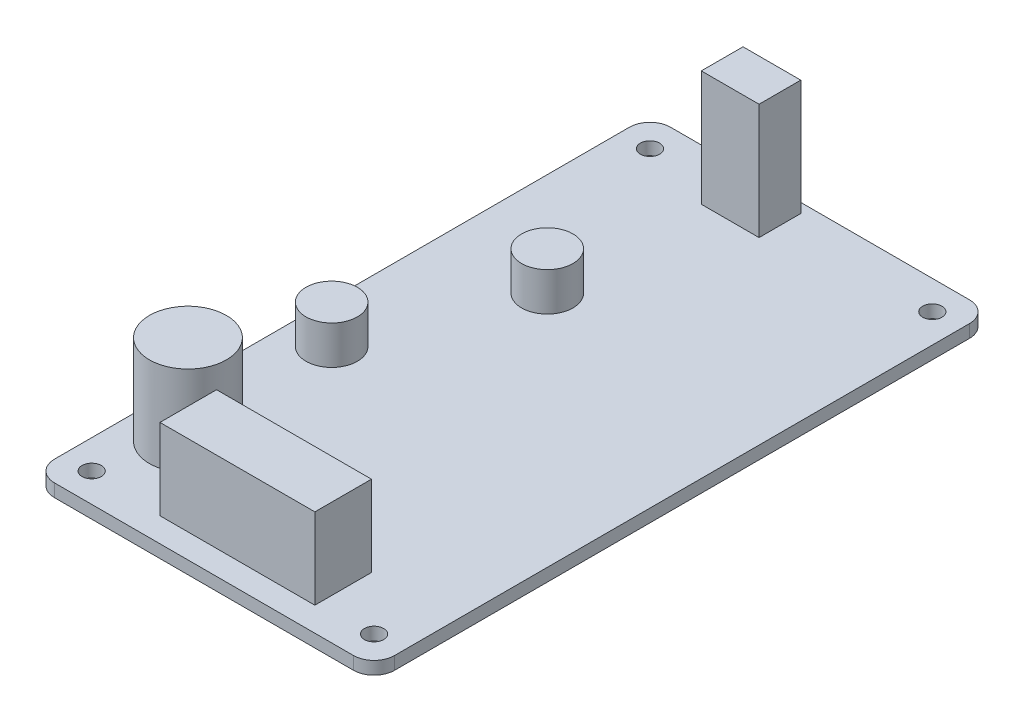
ISO-10303-21;
HEADER;
FILE_DESCRIPTION(('STEP AP214'),'2;1');
FILE_NAME('part.step','',(''),(''),'','','');
FILE_SCHEMA(('AUTOMOTIVE_DESIGN { 1 0 10303 214 1 1 1 1 }'));
ENDSEC;
DATA;
#1=APPLICATION_CONTEXT('core data for automotive mechanical design processes');
#2=APPLICATION_PROTOCOL_DEFINITION('international standard','automotive_design',2000,#1);
#3=PRODUCT_CONTEXT('',#1,'mechanical');
#4=PRODUCT('Part','Part','',(#3));
#5=PRODUCT_RELATED_PRODUCT_CATEGORY('part','',(#4));
#6=PRODUCT_DEFINITION_FORMATION('','',#4);
#7=PRODUCT_DEFINITION_CONTEXT('part definition',#1,'design');
#8=PRODUCT_DEFINITION('design','',#6,#7);
#9=PRODUCT_DEFINITION_SHAPE('','',#8);
#10=(LENGTH_UNIT() NAMED_UNIT(*) SI_UNIT(.MILLI.,.METRE.));
#11=(NAMED_UNIT(*) PLANE_ANGLE_UNIT() SI_UNIT($,.RADIAN.));
#12=(NAMED_UNIT(*) SI_UNIT($,.STERADIAN.) SOLID_ANGLE_UNIT());
#13=UNCERTAINTY_MEASURE_WITH_UNIT(LENGTH_MEASURE(1.E-05),#10,'distance_accuracy_value','');
#14=(GEOMETRIC_REPRESENTATION_CONTEXT(3) GLOBAL_UNCERTAINTY_ASSIGNED_CONTEXT((#13)) GLOBAL_UNIT_ASSIGNED_CONTEXT((#10,
#11,#12)) REPRESENTATION_CONTEXT('',''));
#15=CARTESIAN_POINT('',(0.,0.,0.));
#16=DIRECTION('',(0.,0.,1.));
#17=DIRECTION('',(1.,0.,0.));
#18=AXIS2_PLACEMENT_3D('',#15,#16,#17);
#19=CARTESIAN_POINT('',(-18.494375,0.,35.56));
#20=DIRECTION('',(0.,-1.,0.));
#21=DIRECTION('',(0.,0.,-1.));
#22=AXIS2_PLACEMENT_3D('',#19,#20,#21);
#23=PLANE('',#22);
#24=CARTESIAN_POINT('',(-15.954375,0.,6.34999999999999));
#25=DIRECTION('',(0.,-1.,0.));
#26=DIRECTION('',(0.,0.,-1.));
#27=AXIS2_PLACEMENT_3D('',#24,#25,#26);
#28=CIRCLE('',#27,3.175);
#29=CARTESIAN_POINT('',(-15.954375,0.,3.17499999999999));
#30=VERTEX_POINT('',#29);
#31=EDGE_CURVE('E42',#30,#30,#28,.F.);
#32=ORIENTED_EDGE('',*,*,#31,.F.);
#33=EDGE_LOOP('',(#32));
#34=FACE_BOUND('',#33,.T.);
#35=CARTESIAN_POINT('',(17.4625,0.,-34.528125));
#36=DIRECTION('',(0.,-1.,0.));
#37=DIRECTION('',(0.,0.,-1.));
#38=AXIS2_PLACEMENT_3D('',#35,#36,#37);
#39=CIRCLE('',#38,1.190625);
#40=CARTESIAN_POINT('',(17.4625,0.,-35.71875));
#41=VERTEX_POINT('',#40);
#42=EDGE_CURVE('E287',#41,#41,#39,.T.);
#43=ORIENTED_EDGE('',*,*,#42,.T.);
#44=EDGE_LOOP('',(#43));
#45=FACE_BOUND('',#44,.T.);
#46=CARTESIAN_POINT('',(17.4625,0.,34.528125));
#47=DIRECTION('',(0.,1.,0.));
#48=DIRECTION('',(0.,0.,1.));
#49=AXIS2_PLACEMENT_3D('',#46,#47,#48);
#50=CIRCLE('',#49,1.190625);
#51=CARTESIAN_POINT('',(17.4625,0.,35.71875));
#52=VERTEX_POINT('',#51);
#53=EDGE_CURVE('E291',#52,#52,#50,.T.);
#54=ORIENTED_EDGE('',*,*,#53,.F.);
#55=EDGE_LOOP('',(#54));
#56=FACE_BOUND('',#55,.T.);
#57=DIRECTION('',(0.,0.,1.));
#58=VECTOR('',#57,1.);
#59=CARTESIAN_POINT('',(-8.44549999999997,0.,28.1));
#60=LINE('',#59,#58);
#61=CARTESIAN_POINT('',(-8.44549999999997,0.,28.1));
#62=VERTEX_POINT('',#61);
#63=CARTESIAN_POINT('',(-8.44549999999997,0.,35.1));
#64=VERTEX_POINT('',#63);
#65=EDGE_CURVE('E177',#62,#64,#60,.T.);
#66=ORIENTED_EDGE('',*,*,#65,.F.);
#67=DIRECTION('',(1.,0.,0.));
#68=VECTOR('',#67,1.);
#69=CARTESIAN_POINT('',(-8.44549999999997,0.,28.1));
#70=LINE('',#69,#68);
#71=CARTESIAN_POINT('',(10.715625,0.,28.1));
#72=VERTEX_POINT('',#71);
#73=EDGE_CURVE('E173',#62,#72,#70,.T.);
#74=ORIENTED_EDGE('',*,*,#73,.T.);
#75=DIRECTION('',(0.,0.,1.));
#76=VECTOR('',#75,1.);
#77=CARTESIAN_POINT('',(10.715625,0.,28.1));
#78=LINE('',#77,#76);
#79=CARTESIAN_POINT('',(10.715625,0.,35.1));
#80=VERTEX_POINT('',#79);
#81=EDGE_CURVE('E49',#72,#80,#78,.T.);
#82=ORIENTED_EDGE('',*,*,#81,.T.);
#83=DIRECTION('',(1.,0.,0.));
#84=VECTOR('',#83,1.);
#85=CARTESIAN_POINT('',(-8.44549999999997,0.,35.1));
#86=LINE('',#85,#84);
#87=EDGE_CURVE('E643',#64,#80,#86,.T.);
#88=ORIENTED_EDGE('',*,*,#87,.F.);
#89=EDGE_LOOP('',(#66,#74,#82,#88));
#90=FACE_BOUND('',#89,.T.);
#91=DIRECTION('',(1.,0.,0.));
#92=VECTOR('',#91,1.);
#93=CARTESIAN_POINT('',(-8.334375,0.,-36.909375));
#94=LINE('',#93,#92);
#95=CARTESIAN_POINT('',(-8.334375,0.,-36.909375));
#96=VERTEX_POINT('',#95);
#97=CARTESIAN_POINT('',(-1.19062499999998,0.,-36.909375));
#98=VERTEX_POINT('',#97);
#99=EDGE_CURVE('E247',#96,#98,#94,.T.);
#100=ORIENTED_EDGE('',*,*,#99,.T.);
#101=DIRECTION('',(0.,0.,1.));
#102=VECTOR('',#101,1.);
#103=CARTESIAN_POINT('',(-1.19062499999998,0.,-36.909375));
#104=LINE('',#103,#102);
#105=CARTESIAN_POINT('',(-1.19062499999998,0.,-31.75));
#106=VERTEX_POINT('',#105);
#107=EDGE_CURVE('E259',#98,#106,#104,.T.);
#108=ORIENTED_EDGE('',*,*,#107,.T.);
#109=DIRECTION('',(1.,0.,0.));
#110=VECTOR('',#109,1.);
#111=CARTESIAN_POINT('',(-8.334375,0.,-31.75));
#112=LINE('',#111,#110);
#113=CARTESIAN_POINT('',(-8.334375,0.,-31.75));
#114=VERTEX_POINT('',#113);
#115=EDGE_CURVE('E262',#114,#106,#112,.T.);
#116=ORIENTED_EDGE('',*,*,#115,.F.);
#117=DIRECTION('',(0.,0.,1.));
#118=VECTOR('',#117,1.);
#119=CARTESIAN_POINT('',(-8.334375,0.,-36.909375));
#120=LINE('',#119,#118);
#121=EDGE_CURVE('E251',#96,#114,#120,.T.);
#122=ORIENTED_EDGE('',*,*,#121,.F.);
#123=EDGE_LOOP('',(#100,#108,#116,#122));
#124=FACE_BOUND('',#123,.T.);
#125=CARTESIAN_POINT('',(-18.494375,0.,35.56));
#126=DIRECTION('',(0.,-1.,0.));
#127=DIRECTION('',(0.,0.,-1.));
#128=AXIS2_PLACEMENT_3D('',#125,#126,#127);
#129=CIRCLE('',#128,2.54);
#130=CARTESIAN_POINT('',(-18.494375,0.,38.1));
#131=VERTEX_POINT('',#130);
#132=CARTESIAN_POINT('',(-21.034375,0.,35.56));
#133=VERTEX_POINT('',#132);
#134=EDGE_CURVE('E179',#131,#133,#129,.T.);
#135=ORIENTED_EDGE('',*,*,#134,.F.);
#136=DIRECTION('',(-1.,0.,0.));
#137=VECTOR('',#136,1.);
#138=CARTESIAN_POINT('',(18.494375,0.,38.1));
#139=LINE('',#138,#137);
#140=CARTESIAN_POINT('',(18.494375,0.,38.1));
#141=VERTEX_POINT('',#140);
#142=EDGE_CURVE('E192',#141,#131,#139,.T.);
#143=ORIENTED_EDGE('',*,*,#142,.F.);
#144=CARTESIAN_POINT('',(18.494375,0.,35.56));
#145=DIRECTION('',(0.,1.,0.));
#146=DIRECTION('',(0.,0.,1.));
#147=AXIS2_PLACEMENT_3D('',#144,#145,#146);
#148=CIRCLE('',#147,2.54);
#149=CARTESIAN_POINT('',(21.034375,0.,35.56));
#150=VERTEX_POINT('',#149);
#151=EDGE_CURVE('E226',#141,#150,#148,.T.);
#152=ORIENTED_EDGE('',*,*,#151,.T.);
#153=DIRECTION('',(0.,0.,-1.));
#154=VECTOR('',#153,1.);
#155=CARTESIAN_POINT('',(21.034375,0.,35.56));
#156=LINE('',#155,#154);
#157=CARTESIAN_POINT('',(21.034375,0.,-35.56));
#158=VERTEX_POINT('',#157);
#159=EDGE_CURVE('E223',#150,#158,#156,.T.);
#160=ORIENTED_EDGE('',*,*,#159,.T.);
#161=CARTESIAN_POINT('',(18.494375,0.,-35.56));
#162=DIRECTION('',(0.,1.,0.));
#163=DIRECTION('',(0.,0.,1.));
#164=AXIS2_PLACEMENT_3D('',#161,#162,#163);
#165=CIRCLE('',#164,2.54);
#166=CARTESIAN_POINT('',(18.494375,0.,-38.1));
#167=VERTEX_POINT('',#166);
#168=EDGE_CURVE('E220',#158,#167,#165,.T.);
#169=ORIENTED_EDGE('',*,*,#168,.T.);
#170=DIRECTION('',(-1.,0.,0.));
#171=VECTOR('',#170,1.);
#172=CARTESIAN_POINT('',(18.494375,0.,-38.1));
#173=LINE('',#172,#171);
#174=CARTESIAN_POINT('',(-18.494375,0.,-38.1));
#175=VERTEX_POINT('',#174);
#176=EDGE_CURVE('E217',#167,#175,#173,.T.);
#177=ORIENTED_EDGE('',*,*,#176,.T.);
#178=CARTESIAN_POINT('',(-18.494375,0.,-35.56));
#179=DIRECTION('',(0.,1.,0.));
#180=DIRECTION('',(0.,0.,1.));
#181=AXIS2_PLACEMENT_3D('',#178,#179,#180);
#182=CIRCLE('',#181,2.54);
#183=CARTESIAN_POINT('',(-21.034375,0.,-35.56));
#184=VERTEX_POINT('',#183);
#185=EDGE_CURVE('E214',#175,#184,#182,.T.);
#186=ORIENTED_EDGE('',*,*,#185,.T.);
#187=DIRECTION('',(0.,0.,-1.));
#188=VECTOR('',#187,1.);
#189=CARTESIAN_POINT('',(-21.034375,0.,35.56));
#190=LINE('',#189,#188);
#191=EDGE_CURVE('E182',#133,#184,#190,.T.);
#192=ORIENTED_EDGE('',*,*,#191,.F.);
#193=EDGE_LOOP('',(#135,#143,#152,#160,#169,#177,#186,#192));
#194=FACE_BOUND('',#193,.T.);
#195=CARTESIAN_POINT('',(-17.4625,0.,-34.528125));
#196=DIRECTION('',(0.,1.,0.));
#197=DIRECTION('',(0.,0.,1.));
#198=AXIS2_PLACEMENT_3D('',#195,#196,#197);
#199=CIRCLE('',#198,1.190625);
#200=CARTESIAN_POINT('',(-17.4625,0.,-33.3375));
#201=VERTEX_POINT('',#200);
#202=EDGE_CURVE('E302',#201,#201,#199,.T.);
#203=ORIENTED_EDGE('',*,*,#202,.F.);
#204=EDGE_LOOP('',(#203));
#205=FACE_BOUND('',#204,.T.);
#206=CARTESIAN_POINT('',(-17.4625,0.,34.528125));
#207=DIRECTION('',(0.,1.,0.));
#208=DIRECTION('',(0.,0.,1.));
#209=AXIS2_PLACEMENT_3D('',#206,#207,#208);
#210=CIRCLE('',#209,1.190625);
#211=CARTESIAN_POINT('',(-17.4625,0.,35.71875));
#212=VERTEX_POINT('',#211);
#213=EDGE_CURVE('E306',#212,#212,#210,.F.);
#214=ORIENTED_EDGE('',*,*,#213,.T.);
#215=EDGE_LOOP('',(#214));
#216=FACE_BOUND('',#215,.T.);
#217=CARTESIAN_POINT('',(-14.684375,0.,25.4));
#218=DIRECTION('',(0.,-1.,0.));
#219=DIRECTION('',(0.,0.,-1.));
#220=AXIS2_PLACEMENT_3D('',#217,#218,#219);
#221=CIRCLE('',#220,4.7625);
#222=CARTESIAN_POINT('',(-14.684375,0.,20.6375));
#223=VERTEX_POINT('',#222);
#224=EDGE_CURVE('E266',#223,#223,#221,.F.);
#225=ORIENTED_EDGE('',*,*,#224,.F.);
#226=EDGE_LOOP('',(#225));
#227=FACE_BOUND('',#226,.T.);
#228=CARTESIAN_POINT('',(-8.334375,0.,-12.7));
#229=DIRECTION('',(0.,-1.,0.));
#230=DIRECTION('',(0.,0.,-1.));
#231=AXIS2_PLACEMENT_3D('',#228,#229,#230);
#232=CIRCLE('',#231,3.175);
#233=CARTESIAN_POINT('',(-8.334375,0.,-15.875));
#234=VERTEX_POINT('',#233);
#235=EDGE_CURVE('E11',#234,#234,#232,.F.);
#236=ORIENTED_EDGE('',*,*,#235,.F.);
#237=EDGE_LOOP('',(#236));
#238=FACE_BOUND('',#237,.T.);
#239=ADVANCED_FACE('F34',(#34,#45,#56,#90,#124,#194,#205,#216,#227,#238),#23,.F.);
#240=CARTESIAN_POINT('',(-18.494375,-1.5875,35.56));
#241=DIRECTION('',(0.,-1.,0.));
#242=DIRECTION('',(0.,0.,-1.));
#243=AXIS2_PLACEMENT_3D('',#240,#241,#242);
#244=PLANE('',#243);
#245=CARTESIAN_POINT('',(-17.4625,-1.5875,34.528125));
#246=DIRECTION('',(0.,1.,0.));
#247=DIRECTION('',(0.,0.,1.));
#248=AXIS2_PLACEMENT_3D('',#245,#246,#247);
#249=CIRCLE('',#248,1.190625);
#250=CARTESIAN_POINT('',(-17.4625,-1.5875,35.71875));
#251=VERTEX_POINT('',#250);
#252=EDGE_CURVE('E630',#251,#251,#249,.F.);
#253=ORIENTED_EDGE('',*,*,#252,.F.);
#254=EDGE_LOOP('',(#253));
#255=FACE_BOUND('',#254,.T.);
#256=CARTESIAN_POINT('',(-17.4625,-1.5875,-34.528125));
#257=DIRECTION('',(0.,1.,0.));
#258=DIRECTION('',(0.,0.,1.));
#259=AXIS2_PLACEMENT_3D('',#256,#257,#258);
#260=CIRCLE('',#259,1.190625);
#261=CARTESIAN_POINT('',(-17.4625,-1.5875,-33.3375));
#262=VERTEX_POINT('',#261);
#263=EDGE_CURVE('E635',#262,#262,#260,.T.);
#264=ORIENTED_EDGE('',*,*,#263,.T.);
#265=EDGE_LOOP('',(#264));
#266=FACE_BOUND('',#265,.T.);
#267=CARTESIAN_POINT('',(-18.494375,-1.5875,35.56));
#268=DIRECTION('',(0.,-1.,0.));
#269=DIRECTION('',(0.,0.,-1.));
#270=AXIS2_PLACEMENT_3D('',#267,#268,#269);
#271=CIRCLE('',#270,2.54);
#272=CARTESIAN_POINT('',(-18.494375,-1.5875,38.1));
#273=VERTEX_POINT('',#272);
#274=CARTESIAN_POINT('',(-21.034375,-1.5875,35.56));
#275=VERTEX_POINT('',#274);
#276=EDGE_CURVE('E188',#273,#275,#271,.T.);
#277=ORIENTED_EDGE('',*,*,#276,.T.);
#278=DIRECTION('',(0.,0.,-1.));
#279=VECTOR('',#278,1.);
#280=CARTESIAN_POINT('',(-21.034375,-1.5875,35.56));
#281=LINE('',#280,#279);
#282=CARTESIAN_POINT('',(-21.034375,-1.5875,-35.56));
#283=VERTEX_POINT('',#282);
#284=EDGE_CURVE('E191',#275,#283,#281,.T.);
#285=ORIENTED_EDGE('',*,*,#284,.T.);
#286=CARTESIAN_POINT('',(-18.494375,-1.5875,-35.56));
#287=DIRECTION('',(0.,1.,0.));
#288=DIRECTION('',(0.,0.,1.));
#289=AXIS2_PLACEMENT_3D('',#286,#287,#288);
#290=CIRCLE('',#289,2.54);
#291=CARTESIAN_POINT('',(-18.494375,-1.5875,-38.1));
#292=VERTEX_POINT('',#291);
#293=EDGE_CURVE('E194',#292,#283,#290,.T.);
#294=ORIENTED_EDGE('',*,*,#293,.F.);
#295=DIRECTION('',(-1.,0.,0.));
#296=VECTOR('',#295,1.);
#297=CARTESIAN_POINT('',(18.494375,-1.5875,-38.1));
#298=LINE('',#297,#296);
#299=CARTESIAN_POINT('',(18.494375,-1.5875,-38.1));
#300=VERTEX_POINT('',#299);
#301=EDGE_CURVE('E197',#300,#292,#298,.T.);
#302=ORIENTED_EDGE('',*,*,#301,.F.);
#303=CARTESIAN_POINT('',(18.494375,-1.5875,-35.56));
#304=DIRECTION('',(0.,1.,0.));
#305=DIRECTION('',(0.,0.,1.));
#306=AXIS2_PLACEMENT_3D('',#303,#304,#305);
#307=CIRCLE('',#306,2.54);
#308=CARTESIAN_POINT('',(21.034375,-1.5875,-35.56));
#309=VERTEX_POINT('',#308);
#310=EDGE_CURVE('E200',#309,#300,#307,.T.);
#311=ORIENTED_EDGE('',*,*,#310,.F.);
#312=DIRECTION('',(0.,0.,-1.));
#313=VECTOR('',#312,1.);
#314=CARTESIAN_POINT('',(21.034375,-1.5875,35.56));
#315=LINE('',#314,#313);
#316=CARTESIAN_POINT('',(21.034375,-1.5875,35.56));
#317=VERTEX_POINT('',#316);
#318=EDGE_CURVE('E203',#317,#309,#315,.T.);
#319=ORIENTED_EDGE('',*,*,#318,.F.);
#320=CARTESIAN_POINT('',(18.494375,-1.5875,35.56));
#321=DIRECTION('',(0.,1.,0.));
#322=DIRECTION('',(0.,0.,1.));
#323=AXIS2_PLACEMENT_3D('',#320,#321,#322);
#324=CIRCLE('',#323,2.54);
#325=CARTESIAN_POINT('',(18.494375,-1.5875,38.1));
#326=VERTEX_POINT('',#325);
#327=EDGE_CURVE('E206',#326,#317,#324,.T.);
#328=ORIENTED_EDGE('',*,*,#327,.F.);
#329=DIRECTION('',(-1.,0.,0.));
#330=VECTOR('',#329,1.);
#331=CARTESIAN_POINT('',(18.494375,-1.5875,38.1));
#332=LINE('',#331,#330);
#333=EDGE_CURVE('E209',#326,#273,#332,.T.);
#334=ORIENTED_EDGE('',*,*,#333,.T.);
#335=EDGE_LOOP('',(#277,#285,#294,#302,#311,#319,#328,#334));
#336=FACE_BOUND('',#335,.T.);
#337=CARTESIAN_POINT('',(17.4625,-1.5875,34.528125));
#338=DIRECTION('',(0.,1.,0.));
#339=DIRECTION('',(0.,0.,1.));
#340=AXIS2_PLACEMENT_3D('',#337,#338,#339);
#341=CIRCLE('',#340,1.190625);
#342=CARTESIAN_POINT('',(17.4625,-1.5875,35.71875));
#343=VERTEX_POINT('',#342);
#344=EDGE_CURVE('E618',#343,#343,#341,.T.);
#345=ORIENTED_EDGE('',*,*,#344,.T.);
#346=EDGE_LOOP('',(#345));
#347=FACE_BOUND('',#346,.T.);
#348=CARTESIAN_POINT('',(17.4625,-1.5875,-34.528125));
#349=DIRECTION('',(0.,-1.,0.));
#350=DIRECTION('',(0.,0.,-1.));
#351=AXIS2_PLACEMENT_3D('',#348,#349,#350);
#352=CIRCLE('',#351,1.190625);
#353=CARTESIAN_POINT('',(17.4625,-1.5875,-35.71875));
#354=VERTEX_POINT('',#353);
#355=EDGE_CURVE('E621',#354,#354,#352,.T.);
#356=ORIENTED_EDGE('',*,*,#355,.F.);
#357=EDGE_LOOP('',(#356));
#358=FACE_BOUND('',#357,.T.);
#359=ADVANCED_FACE('F282',(#255,#266,#336,#347,#358),#244,.T.);
#360=CARTESIAN_POINT('',(-8.334375,14.2875,-36.909375));
#361=DIRECTION('',(0.,0.,-1.));
#362=DIRECTION('',(-1.,0.,0.));
#363=AXIS2_PLACEMENT_3D('',#360,#361,#362);
#364=PLANE('',#363);
#365=ORIENTED_EDGE('',*,*,#99,.F.);
#366=DIRECTION('',(0.,-1.,0.));
#367=VECTOR('',#366,1.);
#368=CARTESIAN_POINT('',(-8.334375,14.2875,-36.909375));
#369=LINE('',#368,#367);
#370=CARTESIAN_POINT('',(-8.334375,14.2875,-36.909375));
#371=VERTEX_POINT('',#370);
#372=EDGE_CURVE('E58',#371,#96,#369,.T.);
#373=ORIENTED_EDGE('',*,*,#372,.F.);
#374=DIRECTION('',(1.,0.,0.));
#375=VECTOR('',#374,1.);
#376=CARTESIAN_POINT('',(-8.334375,14.2875,-36.909375));
#377=LINE('',#376,#375);
#378=CARTESIAN_POINT('',(-1.19062499999998,14.2875,-36.909375));
#379=VERTEX_POINT('',#378);
#380=EDGE_CURVE('E248',#371,#379,#377,.T.);
#381=ORIENTED_EDGE('',*,*,#380,.T.);
#382=DIRECTION('',(0.,-1.,0.));
#383=VECTOR('',#382,1.);
#384=CARTESIAN_POINT('',(-1.19062499999998,14.2875,-36.909375));
#385=LINE('',#384,#383);
#386=EDGE_CURVE('E79',#379,#98,#385,.T.);
#387=ORIENTED_EDGE('',*,*,#386,.T.);
#388=EDGE_LOOP('',(#365,#373,#381,#387));
#389=FACE_BOUND('',#388,.T.);
#390=ADVANCED_FACE('F36',(#389),#364,.T.);
#391=CARTESIAN_POINT('',(-8.334375,14.2875,-36.909375));
#392=DIRECTION('',(1.,0.,0.));
#393=DIRECTION('',(0.,0.,-1.));
#394=AXIS2_PLACEMENT_3D('',#391,#392,#393);
#395=PLANE('',#394);
#396=ORIENTED_EDGE('',*,*,#121,.T.);
#397=DIRECTION('',(0.,-1.,0.));
#398=VECTOR('',#397,1.);
#399=CARTESIAN_POINT('',(-8.334375,14.2875,-31.75));
#400=LINE('',#399,#398);
#401=CARTESIAN_POINT('',(-8.334375,14.2875,-31.75));
#402=VERTEX_POINT('',#401);
#403=EDGE_CURVE('E267',#402,#114,#400,.T.);
#404=ORIENTED_EDGE('',*,*,#403,.F.);
#405=DIRECTION('',(0.,0.,1.));
#406=VECTOR('',#405,1.);
#407=CARTESIAN_POINT('',(-8.334375,14.2875,-36.909375));
#408=LINE('',#407,#406);
#409=EDGE_CURVE('E255',#371,#402,#408,.T.);
#410=ORIENTED_EDGE('',*,*,#409,.F.);
#411=ORIENTED_EDGE('',*,*,#372,.T.);
#412=EDGE_LOOP('',(#396,#404,#410,#411));
#413=FACE_BOUND('',#412,.T.);
#414=ADVANCED_FACE('F407',(#413),#395,.F.);
#415=CARTESIAN_POINT('',(-8.334375,14.2875,-31.75));
#416=DIRECTION('',(0.,0.,-1.));
#417=DIRECTION('',(-1.,0.,0.));
#418=AXIS2_PLACEMENT_3D('',#415,#416,#417);
#419=PLANE('',#418);
#420=ORIENTED_EDGE('',*,*,#115,.T.);
#421=DIRECTION('',(0.,-1.,0.));
#422=VECTOR('',#421,1.);
#423=CARTESIAN_POINT('',(-1.19062499999998,14.2875,-31.75));
#424=LINE('',#423,#422);
#425=CARTESIAN_POINT('',(-1.19062499999998,14.2875,-31.75));
#426=VERTEX_POINT('',#425);
#427=EDGE_CURVE('E270',#426,#106,#424,.T.);
#428=ORIENTED_EDGE('',*,*,#427,.F.);
#429=DIRECTION('',(1.,0.,0.));
#430=VECTOR('',#429,1.);
#431=CARTESIAN_POINT('',(-8.334375,14.2875,-31.75));
#432=LINE('',#431,#430);
#433=EDGE_CURVE('E253',#402,#426,#432,.T.);
#434=ORIENTED_EDGE('',*,*,#433,.F.);
#435=ORIENTED_EDGE('',*,*,#403,.T.);
#436=EDGE_LOOP('',(#420,#428,#434,#435));
#437=FACE_BOUND('',#436,.T.);
#438=ADVANCED_FACE('F410',(#437),#419,.F.);
#439=CARTESIAN_POINT('',(-1.19062499999998,14.2875,-36.909375));
#440=DIRECTION('',(1.,0.,0.));
#441=DIRECTION('',(0.,0.,-1.));
#442=AXIS2_PLACEMENT_3D('',#439,#440,#441);
#443=PLANE('',#442);
#444=ORIENTED_EDGE('',*,*,#107,.F.);
#445=ORIENTED_EDGE('',*,*,#386,.F.);
#446=DIRECTION('',(0.,0.,1.));
#447=VECTOR('',#446,1.);
#448=CARTESIAN_POINT('',(-1.19062499999998,14.2875,-36.909375));
#449=LINE('',#448,#447);
#450=EDGE_CURVE('E250',#379,#426,#449,.T.);
#451=ORIENTED_EDGE('',*,*,#450,.T.);
#452=ORIENTED_EDGE('',*,*,#427,.T.);
#453=EDGE_LOOP('',(#444,#445,#451,#452));
#454=FACE_BOUND('',#453,.T.);
#455=ADVANCED_FACE('F405',(#454),#443,.T.);
#456=CARTESIAN_POINT('',(0.,14.2875,0.));
#457=DIRECTION('',(0.,-1.,0.));
#458=DIRECTION('',(0.,0.,-1.));
#459=AXIS2_PLACEMENT_3D('',#456,#457,#458);
#460=PLANE('',#459);
#461=ORIENTED_EDGE('',*,*,#380,.F.);
#462=ORIENTED_EDGE('',*,*,#409,.T.);
#463=ORIENTED_EDGE('',*,*,#433,.T.);
#464=ORIENTED_EDGE('',*,*,#450,.F.);
#465=EDGE_LOOP('',(#461,#462,#463,#464));
#466=FACE_BOUND('',#465,.T.);
#467=ADVANCED_FACE('F401',(#466),#460,.F.);
#468=CARTESIAN_POINT('',(-18.494375,-1.5875,35.56));
#469=DIRECTION('',(0.,1.,0.));
#470=DIRECTION('',(0.,0.,1.));
#471=AXIS2_PLACEMENT_3D('',#468,#469,#470);
#472=CYLINDRICAL_SURFACE('',#471,2.54);
#473=ORIENTED_EDGE('',*,*,#134,.T.);
#474=DIRECTION('',(0.,1.,0.));
#475=VECTOR('',#474,1.);
#476=CARTESIAN_POINT('',(-21.034375,-1.5875,35.56));
#477=LINE('',#476,#475);
#478=EDGE_CURVE('E244',#275,#133,#477,.T.);
#479=ORIENTED_EDGE('',*,*,#478,.F.);
#480=ORIENTED_EDGE('',*,*,#276,.F.);
#481=DIRECTION('',(0.,1.,0.));
#482=VECTOR('',#481,1.);
#483=CARTESIAN_POINT('',(-18.494375,-1.5875,38.1));
#484=LINE('',#483,#482);
#485=EDGE_CURVE('E210',#273,#131,#484,.T.);
#486=ORIENTED_EDGE('',*,*,#485,.T.);
#487=EDGE_LOOP('',(#473,#479,#480,#486));
#488=FACE_BOUND('',#487,.T.);
#489=ADVANCED_FACE('F397',(#488),#472,.T.);
#490=CARTESIAN_POINT('',(-21.034375,-1.5875,35.56));
#491=DIRECTION('',(1.,0.,0.));
#492=DIRECTION('',(0.,0.,-1.));
#493=AXIS2_PLACEMENT_3D('',#490,#491,#492);
#494=PLANE('',#493);
#495=ORIENTED_EDGE('',*,*,#191,.T.);
#496=DIRECTION('',(0.,1.,0.));
#497=VECTOR('',#496,1.);
#498=CARTESIAN_POINT('',(-21.034375,-1.5875,-35.56));
#499=LINE('',#498,#497);
#500=EDGE_CURVE('E242',#283,#184,#499,.T.);
#501=ORIENTED_EDGE('',*,*,#500,.F.);
#502=ORIENTED_EDGE('',*,*,#284,.F.);
#503=ORIENTED_EDGE('',*,*,#478,.T.);
#504=EDGE_LOOP('',(#495,#501,#502,#503));
#505=FACE_BOUND('',#504,.T.);
#506=ADVANCED_FACE('F393',(#505),#494,.F.);
#507=CARTESIAN_POINT('',(-18.494375,-1.5875,-35.56));
#508=DIRECTION('',(0.,1.,0.));
#509=DIRECTION('',(0.,0.,1.));
#510=AXIS2_PLACEMENT_3D('',#507,#508,#509);
#511=CYLINDRICAL_SURFACE('',#510,2.54);
#512=ORIENTED_EDGE('',*,*,#185,.F.);
#513=DIRECTION('',(0.,1.,0.));
#514=VECTOR('',#513,1.);
#515=CARTESIAN_POINT('',(-18.494375,-1.5875,-38.1));
#516=LINE('',#515,#514);
#517=EDGE_CURVE('E240',#292,#175,#516,.T.);
#518=ORIENTED_EDGE('',*,*,#517,.F.);
#519=ORIENTED_EDGE('',*,*,#293,.T.);
#520=ORIENTED_EDGE('',*,*,#500,.T.);
#521=EDGE_LOOP('',(#512,#518,#519,#520));
#522=FACE_BOUND('',#521,.T.);
#523=ADVANCED_FACE('F389',(#522),#511,.T.);
#524=CARTESIAN_POINT('',(18.494375,-1.5875,-38.1));
#525=DIRECTION('',(0.,0.,-1.));
#526=DIRECTION('',(-1.,0.,0.));
#527=AXIS2_PLACEMENT_3D('',#524,#525,#526);
#528=PLANE('',#527);
#529=ORIENTED_EDGE('',*,*,#176,.F.);
#530=DIRECTION('',(0.,1.,0.));
#531=VECTOR('',#530,1.);
#532=CARTESIAN_POINT('',(18.494375,-1.5875,-38.1));
#533=LINE('',#532,#531);
#534=EDGE_CURVE('E238',#300,#167,#533,.T.);
#535=ORIENTED_EDGE('',*,*,#534,.F.);
#536=ORIENTED_EDGE('',*,*,#301,.T.);
#537=ORIENTED_EDGE('',*,*,#517,.T.);
#538=EDGE_LOOP('',(#529,#535,#536,#537));
#539=FACE_BOUND('',#538,.T.);
#540=ADVANCED_FACE('F385',(#539),#528,.T.);
#541=CARTESIAN_POINT('',(18.494375,-1.5875,-35.56));
#542=DIRECTION('',(0.,1.,0.));
#543=DIRECTION('',(0.,0.,1.));
#544=AXIS2_PLACEMENT_3D('',#541,#542,#543);
#545=CYLINDRICAL_SURFACE('',#544,2.54);
#546=ORIENTED_EDGE('',*,*,#168,.F.);
#547=DIRECTION('',(0.,1.,0.));
#548=VECTOR('',#547,1.);
#549=CARTESIAN_POINT('',(21.034375,-1.5875,-35.56));
#550=LINE('',#549,#548);
#551=EDGE_CURVE('E236',#309,#158,#550,.T.);
#552=ORIENTED_EDGE('',*,*,#551,.F.);
#553=ORIENTED_EDGE('',*,*,#310,.T.);
#554=ORIENTED_EDGE('',*,*,#534,.T.);
#555=EDGE_LOOP('',(#546,#552,#553,#554));
#556=FACE_BOUND('',#555,.T.);
#557=ADVANCED_FACE('F381',(#556),#545,.T.);
#558=CARTESIAN_POINT('',(21.034375,-1.5875,35.56));
#559=DIRECTION('',(1.,0.,0.));
#560=DIRECTION('',(0.,0.,-1.));
#561=AXIS2_PLACEMENT_3D('',#558,#559,#560);
#562=PLANE('',#561);
#563=ORIENTED_EDGE('',*,*,#159,.F.);
#564=DIRECTION('',(0.,1.,0.));
#565=VECTOR('',#564,1.);
#566=CARTESIAN_POINT('',(21.034375,-1.5875,35.56));
#567=LINE('',#566,#565);
#568=EDGE_CURVE('E234',#317,#150,#567,.T.);
#569=ORIENTED_EDGE('',*,*,#568,.F.);
#570=ORIENTED_EDGE('',*,*,#318,.T.);
#571=ORIENTED_EDGE('',*,*,#551,.T.);
#572=EDGE_LOOP('',(#563,#569,#570,#571));
#573=FACE_BOUND('',#572,.T.);
#574=ADVANCED_FACE('F377',(#573),#562,.T.);
#575=CARTESIAN_POINT('',(18.494375,-1.5875,35.56));
#576=DIRECTION('',(0.,1.,0.));
#577=DIRECTION('',(0.,0.,1.));
#578=AXIS2_PLACEMENT_3D('',#575,#576,#577);
#579=CYLINDRICAL_SURFACE('',#578,2.54);
#580=ORIENTED_EDGE('',*,*,#151,.F.);
#581=DIRECTION('',(0.,1.,0.));
#582=VECTOR('',#581,1.);
#583=CARTESIAN_POINT('',(18.494375,-1.5875,38.1));
#584=LINE('',#583,#582);
#585=EDGE_CURVE('E232',#326,#141,#584,.T.);
#586=ORIENTED_EDGE('',*,*,#585,.F.);
#587=ORIENTED_EDGE('',*,*,#327,.T.);
#588=ORIENTED_EDGE('',*,*,#568,.T.);
#589=EDGE_LOOP('',(#580,#586,#587,#588));
#590=FACE_BOUND('',#589,.T.);
#591=ADVANCED_FACE('F373',(#590),#579,.T.);
#592=CARTESIAN_POINT('',(18.494375,-1.5875,38.1));
#593=DIRECTION('',(0.,0.,-1.));
#594=DIRECTION('',(-1.,0.,0.));
#595=AXIS2_PLACEMENT_3D('',#592,#593,#594);
#596=PLANE('',#595);
#597=ORIENTED_EDGE('',*,*,#142,.T.);
#598=ORIENTED_EDGE('',*,*,#485,.F.);
#599=ORIENTED_EDGE('',*,*,#333,.F.);
#600=ORIENTED_EDGE('',*,*,#585,.T.);
#601=EDGE_LOOP('',(#597,#598,#599,#600));
#602=FACE_BOUND('',#601,.T.);
#603=ADVANCED_FACE('F367',(#602),#596,.F.);
#604=CARTESIAN_POINT('',(-8.44549999999997,10.,28.1));
#605=DIRECTION('',(1.,0.,0.));
#606=DIRECTION('',(0.,0.,-1.));
#607=AXIS2_PLACEMENT_3D('',#604,#605,#606);
#608=PLANE('',#607);
#609=ORIENTED_EDGE('',*,*,#65,.T.);
#610=DIRECTION('',(0.,-1.,0.));
#611=VECTOR('',#610,1.);
#612=CARTESIAN_POINT('',(-8.44549999999997,10.,35.1));
#613=LINE('',#612,#611);
#614=CARTESIAN_POINT('',(-8.44549999999997,10.,35.1));
#615=VERTEX_POINT('',#614);
#616=EDGE_CURVE('E158',#615,#64,#613,.T.);
#617=ORIENTED_EDGE('',*,*,#616,.F.);
#618=DIRECTION('',(0.,0.,1.));
#619=VECTOR('',#618,1.);
#620=CARTESIAN_POINT('',(-8.44549999999997,10.,28.1));
#621=LINE('',#620,#619);
#622=CARTESIAN_POINT('',(-8.44549999999997,10.,28.1));
#623=VERTEX_POINT('',#622);
#624=EDGE_CURVE('E165',#623,#615,#621,.T.);
#625=ORIENTED_EDGE('',*,*,#624,.F.);
#626=DIRECTION('',(0.,-1.,0.));
#627=VECTOR('',#626,1.);
#628=CARTESIAN_POINT('',(-8.44549999999997,10.,28.1));
#629=LINE('',#628,#627);
#630=EDGE_CURVE('E641',#623,#62,#629,.T.);
#631=ORIENTED_EDGE('',*,*,#630,.T.);
#632=EDGE_LOOP('',(#609,#617,#625,#631));
#633=FACE_BOUND('',#632,.T.);
#634=ADVANCED_FACE('F175',(#633),#608,.F.);
#635=CARTESIAN_POINT('',(-8.44549999999997,10.,35.1));
#636=DIRECTION('',(0.,0.,-1.));
#637=DIRECTION('',(-1.,0.,0.));
#638=AXIS2_PLACEMENT_3D('',#635,#636,#637);
#639=PLANE('',#638);
#640=ORIENTED_EDGE('',*,*,#87,.T.);
#641=DIRECTION('',(0.,-1.,0.));
#642=VECTOR('',#641,1.);
#643=CARTESIAN_POINT('',(10.715625,10.,35.1));
#644=LINE('',#643,#642);
#645=CARTESIAN_POINT('',(10.715625,10.,35.1));
#646=VERTEX_POINT('',#645);
#647=EDGE_CURVE('E160',#646,#80,#644,.T.);
#648=ORIENTED_EDGE('',*,*,#647,.F.);
#649=DIRECTION('',(1.,0.,0.));
#650=VECTOR('',#649,1.);
#651=CARTESIAN_POINT('',(-8.44549999999997,10.,35.1));
#652=LINE('',#651,#650);
#653=EDGE_CURVE('E153',#615,#646,#652,.T.);
#654=ORIENTED_EDGE('',*,*,#653,.F.);
#655=ORIENTED_EDGE('',*,*,#616,.T.);
#656=EDGE_LOOP('',(#640,#648,#654,#655));
#657=FACE_BOUND('',#656,.T.);
#658=ADVANCED_FACE('F156',(#657),#639,.F.);
#659=CARTESIAN_POINT('',(10.715625,10.,28.1));
#660=DIRECTION('',(1.,0.,0.));
#661=DIRECTION('',(0.,0.,-1.));
#662=AXIS2_PLACEMENT_3D('',#659,#660,#661);
#663=PLANE('',#662);
#664=ORIENTED_EDGE('',*,*,#81,.F.);
#665=DIRECTION('',(0.,-1.,0.));
#666=VECTOR('',#665,1.);
#667=CARTESIAN_POINT('',(10.715625,10.,28.1));
#668=LINE('',#667,#666);
#669=CARTESIAN_POINT('',(10.715625,10.,28.1));
#670=VERTEX_POINT('',#669);
#671=EDGE_CURVE('E184',#670,#72,#668,.T.);
#672=ORIENTED_EDGE('',*,*,#671,.F.);
#673=DIRECTION('',(0.,0.,1.));
#674=VECTOR('',#673,1.);
#675=CARTESIAN_POINT('',(10.715625,10.,28.1));
#676=LINE('',#675,#674);
#677=EDGE_CURVE('E164',#670,#646,#676,.T.);
#678=ORIENTED_EDGE('',*,*,#677,.T.);
#679=ORIENTED_EDGE('',*,*,#647,.T.);
#680=EDGE_LOOP('',(#664,#672,#678,#679));
#681=FACE_BOUND('',#680,.T.);
#682=ADVANCED_FACE('F359',(#681),#663,.T.);
#683=CARTESIAN_POINT('',(-8.44549999999997,10.,28.1));
#684=DIRECTION('',(0.,0.,-1.));
#685=DIRECTION('',(-1.,0.,0.));
#686=AXIS2_PLACEMENT_3D('',#683,#684,#685);
#687=PLANE('',#686);
#688=ORIENTED_EDGE('',*,*,#73,.F.);
#689=ORIENTED_EDGE('',*,*,#630,.F.);
#690=DIRECTION('',(1.,0.,0.));
#691=VECTOR('',#690,1.);
#692=CARTESIAN_POINT('',(-8.44549999999997,10.,28.1));
#693=LINE('',#692,#691);
#694=EDGE_CURVE('E171',#623,#670,#693,.T.);
#695=ORIENTED_EDGE('',*,*,#694,.T.);
#696=ORIENTED_EDGE('',*,*,#671,.T.);
#697=EDGE_LOOP('',(#688,#689,#695,#696));
#698=FACE_BOUND('',#697,.T.);
#699=ADVANCED_FACE('F356',(#698),#687,.T.);
#700=CARTESIAN_POINT('',(0.,10.,0.));
#701=DIRECTION('',(0.,1.,0.));
#702=DIRECTION('',(0.,0.,1.));
#703=AXIS2_PLACEMENT_3D('',#700,#701,#702);
#704=PLANE('',#703);
#705=ORIENTED_EDGE('',*,*,#624,.T.);
#706=ORIENTED_EDGE('',*,*,#653,.T.);
#707=ORIENTED_EDGE('',*,*,#677,.F.);
#708=ORIENTED_EDGE('',*,*,#694,.F.);
#709=EDGE_LOOP('',(#705,#706,#707,#708));
#710=FACE_BOUND('',#709,.T.);
#711=ADVANCED_FACE('F169',(#710),#704,.T.);
#712=CARTESIAN_POINT('',(-17.4625,-1.5875,-34.528125));
#713=DIRECTION('',(0.,1.,0.));
#714=DIRECTION('',(0.,0.,1.));
#715=AXIS2_PLACEMENT_3D('',#712,#713,#714);
#716=CYLINDRICAL_SURFACE('',#715,1.190625);
#717=ORIENTED_EDGE('',*,*,#263,.F.);
#718=EDGE_LOOP('',(#717));
#719=FACE_BOUND('',#718,.T.);
#720=ORIENTED_EDGE('',*,*,#202,.T.);
#721=EDGE_LOOP('',(#720));
#722=FACE_BOUND('',#721,.T.);
#723=ADVANCED_FACE('F349',(#719,#722),#716,.F.);
#724=CARTESIAN_POINT('',(-17.4625,-1.5875,34.528125));
#725=DIRECTION('',(0.,1.,0.));
#726=DIRECTION('',(0.,0.,1.));
#727=AXIS2_PLACEMENT_3D('',#724,#725,#726);
#728=CYLINDRICAL_SURFACE('',#727,1.190625);
#729=ORIENTED_EDGE('',*,*,#252,.T.);
#730=EDGE_LOOP('',(#729));
#731=FACE_BOUND('',#730,.T.);
#732=ORIENTED_EDGE('',*,*,#213,.F.);
#733=EDGE_LOOP('',(#732));
#734=FACE_BOUND('',#733,.T.);
#735=ADVANCED_FACE('F345',(#731,#734),#728,.F.);
#736=CARTESIAN_POINT('',(17.4625,-1.5875,34.528125));
#737=DIRECTION('',(0.,1.,0.));
#738=DIRECTION('',(0.,0.,1.));
#739=AXIS2_PLACEMENT_3D('',#736,#737,#738);
#740=CYLINDRICAL_SURFACE('',#739,1.190625);
#741=ORIENTED_EDGE('',*,*,#344,.F.);
#742=EDGE_LOOP('',(#741));
#743=FACE_BOUND('',#742,.T.);
#744=ORIENTED_EDGE('',*,*,#53,.T.);
#745=EDGE_LOOP('',(#744));
#746=FACE_BOUND('',#745,.T.);
#747=ADVANCED_FACE('F341',(#743,#746),#740,.F.);
#748=CARTESIAN_POINT('',(17.4625,-1.5875,-34.528125));
#749=DIRECTION('',(0.,1.,0.));
#750=DIRECTION('',(0.,0.,1.));
#751=AXIS2_PLACEMENT_3D('',#748,#749,#750);
#752=CYLINDRICAL_SURFACE('',#751,1.190625);
#753=ORIENTED_EDGE('',*,*,#355,.T.);
#754=EDGE_LOOP('',(#753));
#755=FACE_BOUND('',#754,.T.);
#756=ORIENTED_EDGE('',*,*,#42,.F.);
#757=EDGE_LOOP('',(#756));
#758=FACE_BOUND('',#757,.T.);
#759=ADVANCED_FACE('F337',(#755,#758),#752,.F.);
#760=CARTESIAN_POINT('',(-14.684375,11.1125,25.4));
#761=DIRECTION('',(0.,-1.,0.));
#762=DIRECTION('',(0.,0.,-1.));
#763=AXIS2_PLACEMENT_3D('',#760,#761,#762);
#764=CYLINDRICAL_SURFACE('',#763,4.7625);
#765=CARTESIAN_POINT('',(-14.684375,11.1125,25.4));
#766=DIRECTION('',(0.,1.,0.));
#767=DIRECTION('',(0.,0.,1.));
#768=AXIS2_PLACEMENT_3D('',#765,#766,#767);
#769=CIRCLE('',#768,4.7625);
#770=CARTESIAN_POINT('',(-14.684375,11.1125,30.1625));
#771=VERTEX_POINT('',#770);
#772=EDGE_CURVE('E622',#771,#771,#769,.T.);
#773=ORIENTED_EDGE('',*,*,#772,.F.);
#774=EDGE_LOOP('',(#773));
#775=FACE_BOUND('',#774,.T.);
#776=ORIENTED_EDGE('',*,*,#224,.T.);
#777=EDGE_LOOP('',(#776));
#778=FACE_BOUND('',#777,.T.);
#779=ADVANCED_FACE('F333',(#775,#778),#764,.T.);
#780=CARTESIAN_POINT('',(0.,11.1125,0.));
#781=DIRECTION('',(0.,1.,0.));
#782=DIRECTION('',(0.,0.,1.));
#783=AXIS2_PLACEMENT_3D('',#780,#781,#782);
#784=PLANE('',#783);
#785=ORIENTED_EDGE('',*,*,#772,.T.);
#786=EDGE_LOOP('',(#785));
#787=FACE_BOUND('',#786,.T.);
#788=ADVANCED_FACE('F329',(#787),#784,.T.);
#789=CARTESIAN_POINT('',(-15.954375,4.7625,6.34999999999999));
#790=DIRECTION('',(0.,-1.,0.));
#791=DIRECTION('',(0.,0.,-1.));
#792=AXIS2_PLACEMENT_3D('',#789,#790,#791);
#793=CYLINDRICAL_SURFACE('',#792,3.175);
#794=CARTESIAN_POINT('',(-15.954375,4.7625,6.34999999999999));
#795=DIRECTION('',(0.,1.,0.));
#796=DIRECTION('',(0.,0.,1.));
#797=AXIS2_PLACEMENT_3D('',#794,#795,#796);
#798=CIRCLE('',#797,3.175);
#799=CARTESIAN_POINT('',(-15.954375,4.7625,3.17499999999999));
#800=VERTEX_POINT('',#799);
#801=EDGE_CURVE('E626',#800,#800,#798,.T.);
#802=CARTESIAN_POINT('',(-15.954375,4.7625,3.17499999999999));
#803=CARTESIAN_POINT('',(-15.954375,4.712890625,3.17499999999999));
#804=CARTESIAN_POINT('',(-15.954375,4.66328125,3.17499999999999));
#805=CARTESIAN_POINT('',(-15.954375,4.5640625,3.17499999999999));
#806=CARTESIAN_POINT('',(-15.954375,4.514453125,3.17499999999999));
#807=CARTESIAN_POINT('',(-15.954375,4.415234375,3.17499999999999));
#808=CARTESIAN_POINT('',(-15.954375,4.365625,3.17499999999999));
#809=CARTESIAN_POINT('',(-15.954375,4.26640625,3.17499999999999));
#810=CARTESIAN_POINT('',(-15.954375,4.216796875,3.17499999999999));
#811=CARTESIAN_POINT('',(-15.954375,4.117578125,3.17499999999999));
#812=CARTESIAN_POINT('',(-15.954375,4.06796875,3.17499999999999));
#813=CARTESIAN_POINT('',(-15.954375,3.96875,3.17499999999999));
#814=CARTESIAN_POINT('',(-15.954375,3.919140625,3.17499999999999));
#815=CARTESIAN_POINT('',(-15.954375,3.819921875,3.17499999999999));
#816=CARTESIAN_POINT('',(-15.954375,3.7703125,3.17499999999999));
#817=CARTESIAN_POINT('',(-15.954375,3.67109375,3.17499999999999));
#818=CARTESIAN_POINT('',(-15.954375,3.621484375,3.17499999999999));
#819=CARTESIAN_POINT('',(-15.954375,3.522265625,3.17499999999999));
#820=CARTESIAN_POINT('',(-15.954375,3.47265625,3.17499999999999));
#821=CARTESIAN_POINT('',(-15.954375,3.3734375,3.17499999999999));
#822=CARTESIAN_POINT('',(-15.954375,3.323828125,3.17499999999999));
#823=CARTESIAN_POINT('',(-15.954375,3.224609375,3.17499999999999));
#824=CARTESIAN_POINT('',(-15.954375,3.175,3.17499999999999));
#825=CARTESIAN_POINT('',(-15.954375,3.07578125,3.17499999999999));
#826=CARTESIAN_POINT('',(-15.954375,3.026171875,3.17499999999999));
#827=CARTESIAN_POINT('',(-15.954375,2.926953125,3.17499999999999));
#828=CARTESIAN_POINT('',(-15.954375,2.87734375,3.17499999999999));
#829=CARTESIAN_POINT('',(-15.954375,2.778125,3.17499999999999));
#830=CARTESIAN_POINT('',(-15.954375,2.728515625,3.17499999999999));
#831=CARTESIAN_POINT('',(-15.954375,2.629296875,3.17499999999999));
#832=CARTESIAN_POINT('',(-15.954375,2.5796875,3.17499999999999));
#833=CARTESIAN_POINT('',(-15.954375,2.48046875,3.17499999999999));
#834=CARTESIAN_POINT('',(-15.954375,2.430859375,3.17499999999999));
#835=CARTESIAN_POINT('',(-15.954375,2.331640625,3.17499999999999));
#836=CARTESIAN_POINT('',(-15.954375,2.28203125,3.17499999999999));
#837=CARTESIAN_POINT('',(-15.954375,2.1828125,3.17499999999999));
#838=CARTESIAN_POINT('',(-15.954375,2.133203125,3.17499999999999));
#839=CARTESIAN_POINT('',(-15.954375,2.033984375,3.17499999999999));
#840=CARTESIAN_POINT('',(-15.954375,1.984375,3.17499999999999));
#841=CARTESIAN_POINT('',(-15.954375,1.88515625,3.17499999999999));
#842=CARTESIAN_POINT('',(-15.954375,1.835546875,3.17499999999999));
#843=CARTESIAN_POINT('',(-15.954375,1.736328125,3.17499999999999));
#844=CARTESIAN_POINT('',(-15.954375,1.68671875,3.17499999999999));
#845=CARTESIAN_POINT('',(-15.954375,1.5875,3.17499999999999));
#846=CARTESIAN_POINT('',(-15.954375,1.537890625,3.17499999999999));
#847=CARTESIAN_POINT('',(-15.954375,1.438671875,3.17499999999999));
#848=CARTESIAN_POINT('',(-15.954375,1.3890625,3.17499999999999));
#849=CARTESIAN_POINT('',(-15.954375,1.28984375,3.17499999999999));
#850=CARTESIAN_POINT('',(-15.954375,1.240234375,3.17499999999999));
#851=CARTESIAN_POINT('',(-15.954375,1.141015625,3.17499999999999));
#852=CARTESIAN_POINT('',(-15.954375,1.09140625,3.17499999999999));
#853=CARTESIAN_POINT('',(-15.954375,0.9921875,3.17499999999999));
#854=CARTESIAN_POINT('',(-15.954375,0.942578125,3.17499999999999));
#855=CARTESIAN_POINT('',(-15.954375,0.843359375,3.17499999999999));
#856=CARTESIAN_POINT('',(-15.954375,0.79375,3.17499999999999));
#857=CARTESIAN_POINT('',(-15.954375,0.69453125,3.17499999999999));
#858=CARTESIAN_POINT('',(-15.954375,0.644921875,3.17499999999999));
#859=CARTESIAN_POINT('',(-15.954375,0.545703125,3.17499999999999));
#860=CARTESIAN_POINT('',(-15.954375,0.49609375,3.17499999999999));
#861=CARTESIAN_POINT('',(-15.954375,0.396875,3.17499999999999));
#862=CARTESIAN_POINT('',(-15.954375,0.347265625,3.17499999999999));
#863=CARTESIAN_POINT('',(-15.954375,0.248046875,3.17499999999999));
#864=CARTESIAN_POINT('',(-15.954375,0.1984375,3.17499999999999));
#865=CARTESIAN_POINT('',(-15.954375,0.09921875,3.17499999999999));
#866=CARTESIAN_POINT('',(-15.954375,0.049609375,3.17499999999999));
#867=CARTESIAN_POINT('',(-15.954375,0.,3.17499999999999));
#868=B_SPLINE_CURVE_WITH_KNOTS('',3,(#802,#803,#804,#805,#806,#807,#808,#809,#810,#811,#812,
#813,#814,#815,#816,#817,#818,#819,#820,#821,#822,#823,#824,#825,#826,#827,#828,#829,#830,#831,
#832,#833,#834,#835,#836,#837,#838,#839,#840,#841,#842,#843,#844,#845,#846,#847,#848,#849,#850,
#851,#852,#853,#854,#855,#856,#857,#858,#859,#860,#861,#862,#863,#864,#865,#866,#867),
.UNSPECIFIED.,.F.,.F.,(4,2,2,2,2,2,2,2,2,2,2,2,2,2,2,2,2,2,2,2,2,2,2,2,2,2,2,2,2,2,2,2,4),(0.,
0.148828124999999,0.297656249999999,0.446484374999999,0.595312499999999,0.744140625,0.89296875,
1.041796875,1.190625,1.339453125,1.48828125,1.637109375,1.7859375,1.934765625,2.08359375,
2.232421875,2.38125,2.530078125,2.67890625,2.827734375,2.9765625,3.125390625,3.27421875,
3.423046875,3.571875,3.720703125,3.86953125,4.018359375,4.1671875,4.316015625,4.46484375,
4.613671875,4.7625),.UNSPECIFIED.);
#869=EDGE_CURVE('BSEAM278',#800,#30,#868,.T.);
#870=ORIENTED_EDGE('',*,*,#801,.F.);
#871=ORIENTED_EDGE('',*,*,#31,.T.);
#872=ORIENTED_EDGE('',*,*,#869,.T.);
#873=ORIENTED_EDGE('',*,*,#869,.F.);
#874=EDGE_LOOP('',(#870,#872,#871,#873));
#875=FACE_BOUND('',#874,.T.);
#876=ADVANCED_FACE('F278',(#875),#793,.T.);
#877=CARTESIAN_POINT('',(0.,4.7625,0.));
#878=DIRECTION('',(0.,1.,0.));
#879=DIRECTION('',(0.,0.,1.));
#880=AXIS2_PLACEMENT_3D('',#877,#878,#879);
#881=PLANE('',#880);
#882=ORIENTED_EDGE('',*,*,#801,.T.);
#883=EDGE_LOOP('',(#882));
#884=FACE_BOUND('',#883,.T.);
#885=ADVANCED_FACE('F314',(#884),#881,.T.);
#886=CARTESIAN_POINT('',(-8.334375,4.7625,-12.7));
#887=DIRECTION('',(0.,-1.,0.));
#888=DIRECTION('',(0.,0.,-1.));
#889=AXIS2_PLACEMENT_3D('',#886,#887,#888);
#890=CYLINDRICAL_SURFACE('',#889,3.175);
#891=CARTESIAN_POINT('',(-8.334375,4.7625,-12.7));
#892=DIRECTION('',(0.,1.,0.));
#893=DIRECTION('',(0.,0.,1.));
#894=AXIS2_PLACEMENT_3D('',#891,#892,#893);
#895=CIRCLE('',#894,3.175);
#896=CARTESIAN_POINT('',(-8.334375,4.7625,-15.875));
#897=VERTEX_POINT('',#896);
#898=EDGE_CURVE('E657',#897,#897,#895,.T.);
#899=CARTESIAN_POINT('',(-8.334375,4.7625,-15.875));
#900=CARTESIAN_POINT('',(-8.334375,4.712890625,-15.875));
#901=CARTESIAN_POINT('',(-8.334375,4.66328125,-15.875));
#902=CARTESIAN_POINT('',(-8.334375,4.5640625,-15.875));
#903=CARTESIAN_POINT('',(-8.334375,4.514453125,-15.875));
#904=CARTESIAN_POINT('',(-8.334375,4.415234375,-15.875));
#905=CARTESIAN_POINT('',(-8.334375,4.365625,-15.875));
#906=CARTESIAN_POINT('',(-8.334375,4.26640625,-15.875));
#907=CARTESIAN_POINT('',(-8.334375,4.216796875,-15.875));
#908=CARTESIAN_POINT('',(-8.334375,4.117578125,-15.875));
#909=CARTESIAN_POINT('',(-8.334375,4.06796875,-15.875));
#910=CARTESIAN_POINT('',(-8.334375,3.96875,-15.875));
#911=CARTESIAN_POINT('',(-8.334375,3.919140625,-15.875));
#912=CARTESIAN_POINT('',(-8.334375,3.819921875,-15.875));
#913=CARTESIAN_POINT('',(-8.334375,3.7703125,-15.875));
#914=CARTESIAN_POINT('',(-8.334375,3.67109375,-15.875));
#915=CARTESIAN_POINT('',(-8.334375,3.621484375,-15.875));
#916=CARTESIAN_POINT('',(-8.334375,3.522265625,-15.875));
#917=CARTESIAN_POINT('',(-8.334375,3.47265625,-15.875));
#918=CARTESIAN_POINT('',(-8.334375,3.3734375,-15.875));
#919=CARTESIAN_POINT('',(-8.334375,3.323828125,-15.875));
#920=CARTESIAN_POINT('',(-8.334375,3.224609375,-15.875));
#921=CARTESIAN_POINT('',(-8.334375,3.175,-15.875));
#922=CARTESIAN_POINT('',(-8.334375,3.07578125,-15.875));
#923=CARTESIAN_POINT('',(-8.334375,3.026171875,-15.875));
#924=CARTESIAN_POINT('',(-8.334375,2.926953125,-15.875));
#925=CARTESIAN_POINT('',(-8.334375,2.87734375,-15.875));
#926=CARTESIAN_POINT('',(-8.334375,2.778125,-15.875));
#927=CARTESIAN_POINT('',(-8.334375,2.728515625,-15.875));
#928=CARTESIAN_POINT('',(-8.334375,2.629296875,-15.875));
#929=CARTESIAN_POINT('',(-8.334375,2.5796875,-15.875));
#930=CARTESIAN_POINT('',(-8.334375,2.48046875,-15.875));
#931=CARTESIAN_POINT('',(-8.334375,2.430859375,-15.875));
#932=CARTESIAN_POINT('',(-8.334375,2.331640625,-15.875));
#933=CARTESIAN_POINT('',(-8.334375,2.28203125,-15.875));
#934=CARTESIAN_POINT('',(-8.334375,2.1828125,-15.875));
#935=CARTESIAN_POINT('',(-8.334375,2.133203125,-15.875));
#936=CARTESIAN_POINT('',(-8.334375,2.033984375,-15.875));
#937=CARTESIAN_POINT('',(-8.334375,1.984375,-15.875));
#938=CARTESIAN_POINT('',(-8.334375,1.88515625,-15.875));
#939=CARTESIAN_POINT('',(-8.334375,1.835546875,-15.875));
#940=CARTESIAN_POINT('',(-8.334375,1.736328125,-15.875));
#941=CARTESIAN_POINT('',(-8.334375,1.68671875,-15.875));
#942=CARTESIAN_POINT('',(-8.334375,1.5875,-15.875));
#943=CARTESIAN_POINT('',(-8.334375,1.537890625,-15.875));
#944=CARTESIAN_POINT('',(-8.334375,1.438671875,-15.875));
#945=CARTESIAN_POINT('',(-8.334375,1.3890625,-15.875));
#946=CARTESIAN_POINT('',(-8.334375,1.28984375,-15.875));
#947=CARTESIAN_POINT('',(-8.334375,1.240234375,-15.875));
#948=CARTESIAN_POINT('',(-8.334375,1.141015625,-15.875));
#949=CARTESIAN_POINT('',(-8.334375,1.09140625,-15.875));
#950=CARTESIAN_POINT('',(-8.334375,0.9921875,-15.875));
#951=CARTESIAN_POINT('',(-8.334375,0.942578125,-15.875));
#952=CARTESIAN_POINT('',(-8.334375,0.843359375,-15.875));
#953=CARTESIAN_POINT('',(-8.334375,0.79375,-15.875));
#954=CARTESIAN_POINT('',(-8.334375,0.69453125,-15.875));
#955=CARTESIAN_POINT('',(-8.334375,0.644921875,-15.875));
#956=CARTESIAN_POINT('',(-8.334375,0.545703125,-15.875));
#957=CARTESIAN_POINT('',(-8.334375,0.49609375,-15.875));
#958=CARTESIAN_POINT('',(-8.334375,0.396875,-15.875));
#959=CARTESIAN_POINT('',(-8.334375,0.347265625,-15.875));
#960=CARTESIAN_POINT('',(-8.334375,0.248046875,-15.875));
#961=CARTESIAN_POINT('',(-8.334375,0.1984375,-15.875));
#962=CARTESIAN_POINT('',(-8.334375,0.09921875,-15.875));
#963=CARTESIAN_POINT('',(-8.334375,0.049609375,-15.875));
#964=CARTESIAN_POINT('',(-8.334375,0.,-15.875));
#965=B_SPLINE_CURVE_WITH_KNOTS('',3,(#899,#900,#901,#902,#903,#904,#905,#906,#907,#908,#909,
#910,#911,#912,#913,#914,#915,#916,#917,#918,#919,#920,#921,#922,#923,#924,#925,#926,#927,#928,
#929,#930,#931,#932,#933,#934,#935,#936,#937,#938,#939,#940,#941,#942,#943,#944,#945,#946,#947,
#948,#949,#950,#951,#952,#953,#954,#955,#956,#957,#958,#959,#960,#961,#962,#963,#964),
.UNSPECIFIED.,.F.,.F.,(4,2,2,2,2,2,2,2,2,2,2,2,2,2,2,2,2,2,2,2,2,2,2,2,2,2,2,2,2,2,2,2,4),(0.,
0.148828124999999,0.297656249999999,0.446484374999999,0.595312499999999,0.744140625,0.89296875,
1.041796875,1.190625,1.339453125,1.48828125,1.637109375,1.7859375,1.934765625,2.08359375,
2.232421875,2.38125,2.530078125,2.67890625,2.827734375,2.9765625,3.125390625,3.27421875,
3.423046875,3.571875,3.720703125,3.86953125,4.018359375,4.1671875,4.316015625,4.46484375,
4.613671875,4.7625),.UNSPECIFIED.);
#966=EDGE_CURVE('BSEAM311',#897,#234,#965,.T.);
#967=ORIENTED_EDGE('',*,*,#898,.F.);
#968=ORIENTED_EDGE('',*,*,#235,.T.);
#969=ORIENTED_EDGE('',*,*,#966,.T.);
#970=ORIENTED_EDGE('',*,*,#966,.F.);
#971=EDGE_LOOP('',(#967,#969,#968,#970));
#972=FACE_BOUND('',#971,.T.);
#973=ADVANCED_FACE('F311',(#972),#890,.T.);
#974=CARTESIAN_POINT('',(0.,4.7625,0.));
#975=DIRECTION('',(0.,1.,0.));
#976=DIRECTION('',(0.,0.,1.));
#977=AXIS2_PLACEMENT_3D('',#974,#975,#976);
#978=PLANE('',#977);
#979=ORIENTED_EDGE('',*,*,#898,.T.);
#980=EDGE_LOOP('',(#979));
#981=FACE_BOUND('',#980,.T.);
#982=ADVANCED_FACE('F313',(#981),#978,.T.);
#983=CLOSED_SHELL('',(#239,#359,#390,#414,#438,#455,#467,#489,#506,#523,#540,#557,#574,#591,
#603,#634,#658,#682,#699,#711,#723,#735,#747,#759,#779,#788,#876,#885,#973,#982));
#984=MANIFOLD_SOLID_BREP('B2',#983);
#985=ADVANCED_BREP_SHAPE_REPRESENTATION('',(#18,#984),#14);
#986=SHAPE_DEFINITION_REPRESENTATION(#9,#985);
ENDSEC;
END-ISO-10303-21;
